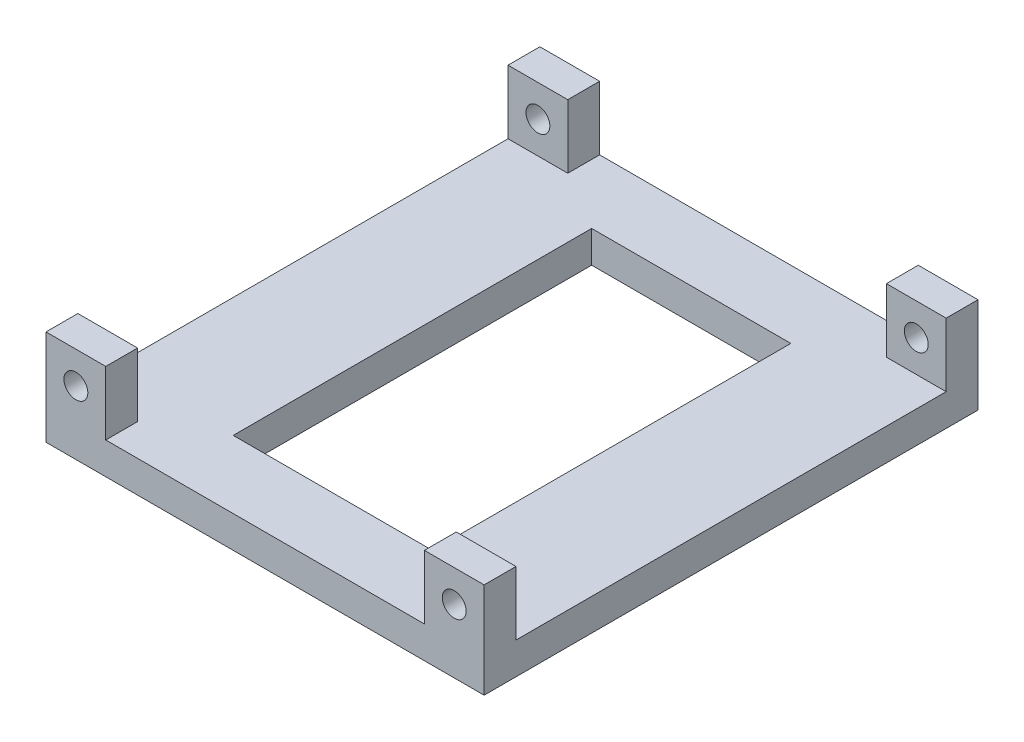
ISO-10303-21;
HEADER;
FILE_DESCRIPTION(('STEP AP214'),'2;1');
FILE_NAME('part.step','',(''),(''),'','','');
FILE_SCHEMA(('AUTOMOTIVE_DESIGN { 1 0 10303 214 1 1 1 1 }'));
ENDSEC;
DATA;
#1=APPLICATION_CONTEXT('core data for automotive mechanical design processes');
#2=APPLICATION_PROTOCOL_DEFINITION('international standard','automotive_design',2000,#1);
#3=PRODUCT_CONTEXT('',#1,'mechanical');
#4=PRODUCT('Part','Part','',(#3));
#5=PRODUCT_RELATED_PRODUCT_CATEGORY('part','',(#4));
#6=PRODUCT_DEFINITION_FORMATION('','',#4);
#7=PRODUCT_DEFINITION_CONTEXT('part definition',#1,'design');
#8=PRODUCT_DEFINITION('design','',#6,#7);
#9=PRODUCT_DEFINITION_SHAPE('','',#8);
#10=(LENGTH_UNIT() NAMED_UNIT(*) SI_UNIT(.MILLI.,.METRE.));
#11=(NAMED_UNIT(*) PLANE_ANGLE_UNIT() SI_UNIT($,.RADIAN.));
#12=(NAMED_UNIT(*) SI_UNIT($,.STERADIAN.) SOLID_ANGLE_UNIT());
#13=UNCERTAINTY_MEASURE_WITH_UNIT(LENGTH_MEASURE(1.E-05),#10,'distance_accuracy_value','');
#14=(GEOMETRIC_REPRESENTATION_CONTEXT(3) GLOBAL_UNCERTAINTY_ASSIGNED_CONTEXT((#13)) GLOBAL_UNIT_ASSIGNED_CONTEXT((#10,
#11,#12)) REPRESENTATION_CONTEXT('',''));
#15=CARTESIAN_POINT('',(0.,0.,0.));
#16=DIRECTION('',(0.,0.,1.));
#17=DIRECTION('',(1.,0.,0.));
#18=AXIS2_PLACEMENT_3D('',#15,#16,#17);
#19=CARTESIAN_POINT('',(0.,4.,0.));
#20=DIRECTION('',(0.,1.,0.));
#21=DIRECTION('',(0.,0.,1.));
#22=AXIS2_PLACEMENT_3D('',#19,#20,#21);
#23=PLANE('',#22);
#24=DIRECTION('',(1.,0.,0.));
#25=VECTOR('',#24,1.);
#26=CARTESIAN_POINT('',(27.5,4.,-27.));
#27=LINE('',#26,#25);
#28=CARTESIAN_POINT('',(20.,4.,-27.));
#29=VERTEX_POINT('',#28);
#30=CARTESIAN_POINT('',(27.5,4.,-27.));
#31=VERTEX_POINT('',#30);
#32=EDGE_CURVE('E61',#29,#31,#27,.T.);
#33=ORIENTED_EDGE('',*,*,#32,.F.);
#34=DIRECTION('',(0.,0.,-1.));
#35=VECTOR('',#34,1.);
#36=CARTESIAN_POINT('',(20.,4.,-27.));
#37=LINE('',#36,#35);
#38=CARTESIAN_POINT('',(20.,4.,-31.));
#39=VERTEX_POINT('',#38);
#40=EDGE_CURVE('E205',#29,#39,#37,.T.);
#41=ORIENTED_EDGE('',*,*,#40,.T.);
#42=DIRECTION('',(-1.,0.,0.));
#43=VECTOR('',#42,1.);
#44=CARTESIAN_POINT('',(-27.5,4.,-31.));
#45=LINE('',#44,#43);
#46=CARTESIAN_POINT('',(-20.,4.,-31.));
#47=VERTEX_POINT('',#46);
#48=EDGE_CURVE('E398',#39,#47,#45,.T.);
#49=ORIENTED_EDGE('',*,*,#48,.T.);
#50=DIRECTION('',(0.,0.,-1.));
#51=VECTOR('',#50,1.);
#52=CARTESIAN_POINT('',(-20.,4.,-27.));
#53=LINE('',#52,#51);
#54=CARTESIAN_POINT('',(-20.,4.,-27.));
#55=VERTEX_POINT('',#54);
#56=EDGE_CURVE('E256',#55,#47,#53,.T.);
#57=ORIENTED_EDGE('',*,*,#56,.F.);
#58=DIRECTION('',(1.,0.,0.));
#59=VECTOR('',#58,1.);
#60=CARTESIAN_POINT('',(-27.5,4.,-27.));
#61=LINE('',#60,#59);
#62=CARTESIAN_POINT('',(-27.5,4.,-27.));
#63=VERTEX_POINT('',#62);
#64=EDGE_CURVE('E246',#63,#55,#61,.T.);
#65=ORIENTED_EDGE('',*,*,#64,.F.);
#66=DIRECTION('',(0.,0.,1.));
#67=VECTOR('',#66,1.);
#68=CARTESIAN_POINT('',(-27.5,4.,-31.));
#69=LINE('',#68,#67);
#70=CARTESIAN_POINT('',(-27.5,4.,27.));
#71=VERTEX_POINT('',#70);
#72=EDGE_CURVE('E402',#63,#71,#69,.T.);
#73=ORIENTED_EDGE('',*,*,#72,.T.);
#74=DIRECTION('',(1.,0.,0.));
#75=VECTOR('',#74,1.);
#76=CARTESIAN_POINT('',(-27.5,4.,27.));
#77=LINE('',#76,#75);
#78=CARTESIAN_POINT('',(-20.,4.,27.));
#79=VERTEX_POINT('',#78);
#80=EDGE_CURVE('E322',#71,#79,#77,.T.);
#81=ORIENTED_EDGE('',*,*,#80,.T.);
#82=DIRECTION('',(0.,0.,1.));
#83=VECTOR('',#82,1.);
#84=CARTESIAN_POINT('',(-20.,4.,27.));
#85=LINE('',#84,#83);
#86=CARTESIAN_POINT('',(-20.,4.,31.));
#87=VERTEX_POINT('',#86);
#88=EDGE_CURVE('E335',#79,#87,#85,.T.);
#89=ORIENTED_EDGE('',*,*,#88,.T.);
#90=DIRECTION('',(1.,0.,0.));
#91=VECTOR('',#90,1.);
#92=CARTESIAN_POINT('',(-27.5,4.,31.));
#93=LINE('',#92,#91);
#94=CARTESIAN_POINT('',(20.,4.,31.));
#95=VERTEX_POINT('',#94);
#96=EDGE_CURVE('E405',#87,#95,#93,.T.);
#97=ORIENTED_EDGE('',*,*,#96,.T.);
#98=DIRECTION('',(0.,0.,1.));
#99=VECTOR('',#98,1.);
#100=CARTESIAN_POINT('',(20.,4.,27.));
#101=LINE('',#100,#99);
#102=CARTESIAN_POINT('',(20.,4.,27.));
#103=VERTEX_POINT('',#102);
#104=EDGE_CURVE('E260',#103,#95,#101,.T.);
#105=ORIENTED_EDGE('',*,*,#104,.F.);
#106=DIRECTION('',(1.,0.,0.));
#107=VECTOR('',#106,1.);
#108=CARTESIAN_POINT('',(27.5,4.,27.));
#109=LINE('',#108,#107);
#110=CARTESIAN_POINT('',(27.5,4.,27.));
#111=VERTEX_POINT('',#110);
#112=EDGE_CURVE('E284',#103,#111,#109,.T.);
#113=ORIENTED_EDGE('',*,*,#112,.T.);
#114=DIRECTION('',(0.,0.,-1.));
#115=VECTOR('',#114,1.);
#116=CARTESIAN_POINT('',(27.5,4.,-31.));
#117=LINE('',#116,#115);
#118=EDGE_CURVE('E66',#111,#31,#117,.T.);
#119=ORIENTED_EDGE('',*,*,#118,.T.);
#120=EDGE_LOOP('',(#33,#41,#49,#57,#65,#73,#81,#89,#97,#105,#113,#119));
#121=FACE_BOUND('',#120,.T.);
#122=DIRECTION('',(-1.,0.,0.));
#123=VECTOR('',#122,1.);
#124=CARTESIAN_POINT('',(-12.5,4.,-22.5));
#125=LINE('',#124,#123);
#126=CARTESIAN_POINT('',(12.5,4.,-22.5));
#127=VERTEX_POINT('',#126);
#128=CARTESIAN_POINT('',(-12.5,4.,-22.5));
#129=VERTEX_POINT('',#128);
#130=EDGE_CURVE('E356',#127,#129,#125,.T.);
#131=ORIENTED_EDGE('',*,*,#130,.F.);
#132=DIRECTION('',(0.,0.,-1.));
#133=VECTOR('',#132,1.);
#134=CARTESIAN_POINT('',(12.5,4.,-22.5));
#135=LINE('',#134,#133);
#136=CARTESIAN_POINT('',(12.5,4.,22.5));
#137=VERTEX_POINT('',#136);
#138=EDGE_CURVE('E353',#137,#127,#135,.T.);
#139=ORIENTED_EDGE('',*,*,#138,.F.);
#140=DIRECTION('',(1.,0.,0.));
#141=VECTOR('',#140,1.);
#142=CARTESIAN_POINT('',(-12.5,4.,22.5));
#143=LINE('',#142,#141);
#144=CARTESIAN_POINT('',(-12.5,4.,22.5));
#145=VERTEX_POINT('',#144);
#146=EDGE_CURVE('E364',#145,#137,#143,.T.);
#147=ORIENTED_EDGE('',*,*,#146,.F.);
#148=DIRECTION('',(0.,0.,1.));
#149=VECTOR('',#148,1.);
#150=CARTESIAN_POINT('',(-12.5,4.,-22.5));
#151=LINE('',#150,#149);
#152=EDGE_CURVE('E360',#129,#145,#151,.T.);
#153=ORIENTED_EDGE('',*,*,#152,.F.);
#154=EDGE_LOOP('',(#131,#139,#147,#153));
#155=FACE_BOUND('',#154,.T.);
#156=ADVANCED_FACE('F45',(#121,#155),#23,.T.);
#157=CARTESIAN_POINT('',(0.,0.,0.));
#158=DIRECTION('',(0.,1.,0.));
#159=DIRECTION('',(0.,0.,1.));
#160=AXIS2_PLACEMENT_3D('',#157,#158,#159);
#161=PLANE('',#160);
#162=DIRECTION('',(0.,0.,-1.));
#163=VECTOR('',#162,1.);
#164=CARTESIAN_POINT('',(27.5,0.,-31.));
#165=LINE('',#164,#163);
#166=CARTESIAN_POINT('',(27.5,0.,31.));
#167=VERTEX_POINT('',#166);
#168=CARTESIAN_POINT('',(27.5,0.,-31.));
#169=VERTEX_POINT('',#168);
#170=EDGE_CURVE('E395',#167,#169,#165,.T.);
#171=ORIENTED_EDGE('',*,*,#170,.F.);
#172=DIRECTION('',(1.,0.,0.));
#173=VECTOR('',#172,1.);
#174=CARTESIAN_POINT('',(-27.5,0.,31.));
#175=LINE('',#174,#173);
#176=CARTESIAN_POINT('',(-27.5,0.,31.));
#177=VERTEX_POINT('',#176);
#178=EDGE_CURVE('E399',#177,#167,#175,.T.);
#179=ORIENTED_EDGE('',*,*,#178,.F.);
#180=DIRECTION('',(0.,0.,1.));
#181=VECTOR('',#180,1.);
#182=CARTESIAN_POINT('',(-27.5,0.,-31.));
#183=LINE('',#182,#181);
#184=CARTESIAN_POINT('',(-27.5,0.,-31.));
#185=VERTEX_POINT('',#184);
#186=EDGE_CURVE('E415',#185,#177,#183,.T.);
#187=ORIENTED_EDGE('',*,*,#186,.F.);
#188=DIRECTION('',(-1.,0.,0.));
#189=VECTOR('',#188,1.);
#190=CARTESIAN_POINT('',(-27.5,0.,-31.));
#191=LINE('',#190,#189);
#192=EDGE_CURVE('E412',#169,#185,#191,.T.);
#193=ORIENTED_EDGE('',*,*,#192,.F.);
#194=EDGE_LOOP('',(#171,#179,#187,#193));
#195=FACE_BOUND('',#194,.T.);
#196=DIRECTION('',(0.,0.,-1.));
#197=VECTOR('',#196,1.);
#198=CARTESIAN_POINT('',(12.5,0.,-22.5));
#199=LINE('',#198,#197);
#200=CARTESIAN_POINT('',(12.5,0.,22.5));
#201=VERTEX_POINT('',#200);
#202=CARTESIAN_POINT('',(12.5,0.,-22.5));
#203=VERTEX_POINT('',#202);
#204=EDGE_CURVE('E346',#201,#203,#199,.T.);
#205=ORIENTED_EDGE('',*,*,#204,.T.);
#206=DIRECTION('',(-1.,0.,0.));
#207=VECTOR('',#206,1.);
#208=CARTESIAN_POINT('',(-12.5,0.,-22.5));
#209=LINE('',#208,#207);
#210=CARTESIAN_POINT('',(-12.5,0.,-22.5));
#211=VERTEX_POINT('',#210);
#212=EDGE_CURVE('E371',#203,#211,#209,.T.);
#213=ORIENTED_EDGE('',*,*,#212,.T.);
#214=DIRECTION('',(0.,0.,1.));
#215=VECTOR('',#214,1.);
#216=CARTESIAN_POINT('',(-12.5,0.,-22.5));
#217=LINE('',#216,#215);
#218=CARTESIAN_POINT('',(-12.5,0.,22.5));
#219=VERTEX_POINT('',#218);
#220=EDGE_CURVE('E375',#211,#219,#217,.T.);
#221=ORIENTED_EDGE('',*,*,#220,.T.);
#222=DIRECTION('',(1.,0.,0.));
#223=VECTOR('',#222,1.);
#224=CARTESIAN_POINT('',(-12.5,0.,22.5));
#225=LINE('',#224,#223);
#226=EDGE_CURVE('E357',#219,#201,#225,.T.);
#227=ORIENTED_EDGE('',*,*,#226,.T.);
#228=EDGE_LOOP('',(#205,#213,#221,#227));
#229=FACE_BOUND('',#228,.T.);
#230=ADVANCED_FACE('F438',(#195,#229),#161,.F.);
#231=CARTESIAN_POINT('',(27.5,4.,-31.));
#232=DIRECTION('',(-1.,0.,0.));
#233=DIRECTION('',(0.,0.,1.));
#234=AXIS2_PLACEMENT_3D('',#231,#232,#233);
#235=PLANE('',#234);
#236=ORIENTED_EDGE('',*,*,#170,.T.);
#237=DIRECTION('',(0.,-1.,0.));
#238=VECTOR('',#237,1.);
#239=CARTESIAN_POINT('',(27.5,4.,-31.));
#240=LINE('',#239,#238);
#241=CARTESIAN_POINT('',(27.5,12.,-31.));
#242=VERTEX_POINT('',#241);
#243=EDGE_CURVE('E11',#242,#169,#240,.T.);
#244=ORIENTED_EDGE('',*,*,#243,.F.);
#245=DIRECTION('',(0.,0.,-1.));
#246=VECTOR('',#245,1.);
#247=CARTESIAN_POINT('',(27.5,12.,-27.));
#248=LINE('',#247,#246);
#249=CARTESIAN_POINT('',(27.5,12.,-27.));
#250=VERTEX_POINT('',#249);
#251=EDGE_CURVE('E204',#250,#242,#248,.T.);
#252=ORIENTED_EDGE('',*,*,#251,.F.);
#253=DIRECTION('',(0.,1.,0.));
#254=VECTOR('',#253,1.);
#255=CARTESIAN_POINT('',(27.5,4.,-27.));
#256=LINE('',#255,#254);
#257=EDGE_CURVE('E189',#31,#250,#256,.T.);
#258=ORIENTED_EDGE('',*,*,#257,.F.);
#259=ORIENTED_EDGE('',*,*,#118,.F.);
#260=DIRECTION('',(0.,1.,0.));
#261=VECTOR('',#260,1.);
#262=CARTESIAN_POINT('',(27.5,4.,27.));
#263=LINE('',#262,#261);
#264=CARTESIAN_POINT('',(27.5,12.,27.));
#265=VERTEX_POINT('',#264);
#266=EDGE_CURVE('E296',#111,#265,#263,.T.);
#267=ORIENTED_EDGE('',*,*,#266,.T.);
#268=DIRECTION('',(0.,0.,1.));
#269=VECTOR('',#268,1.);
#270=CARTESIAN_POINT('',(27.5,12.,27.));
#271=LINE('',#270,#269);
#272=CARTESIAN_POINT('',(27.5,12.,31.));
#273=VERTEX_POINT('',#272);
#274=EDGE_CURVE('E268',#265,#273,#271,.T.);
#275=ORIENTED_EDGE('',*,*,#274,.T.);
#276=DIRECTION('',(0.,-1.,0.));
#277=VECTOR('',#276,1.);
#278=CARTESIAN_POINT('',(27.5,4.,31.));
#279=LINE('',#278,#277);
#280=EDGE_CURVE('E408',#273,#167,#279,.T.);
#281=ORIENTED_EDGE('',*,*,#280,.T.);
#282=EDGE_LOOP('',(#236,#244,#252,#258,#259,#267,#275,#281));
#283=FACE_BOUND('',#282,.T.);
#284=ADVANCED_FACE('F47',(#283),#235,.F.);
#285=CARTESIAN_POINT('',(-27.5,4.,-31.));
#286=DIRECTION('',(0.,0.,1.));
#287=DIRECTION('',(1.,0.,0.));
#288=AXIS2_PLACEMENT_3D('',#285,#286,#287);
#289=PLANE('',#288);
#290=ORIENTED_EDGE('',*,*,#192,.T.);
#291=DIRECTION('',(0.,-1.,0.));
#292=VECTOR('',#291,1.);
#293=CARTESIAN_POINT('',(-27.5,4.,-31.));
#294=LINE('',#293,#292);
#295=CARTESIAN_POINT('',(-27.5,12.,-31.));
#296=VERTEX_POINT('',#295);
#297=EDGE_CURVE('E54',#296,#185,#294,.T.);
#298=ORIENTED_EDGE('',*,*,#297,.F.);
#299=DIRECTION('',(-1.,0.,0.));
#300=VECTOR('',#299,1.);
#301=CARTESIAN_POINT('',(-27.5,12.,-31.));
#302=LINE('',#301,#300);
#303=CARTESIAN_POINT('',(-20.,12.,-31.));
#304=VERTEX_POINT('',#303);
#305=EDGE_CURVE('E231',#304,#296,#302,.T.);
#306=ORIENTED_EDGE('',*,*,#305,.F.);
#307=DIRECTION('',(0.,1.,0.));
#308=VECTOR('',#307,1.);
#309=CARTESIAN_POINT('',(-20.,4.,-31.));
#310=LINE('',#309,#308);
#311=EDGE_CURVE('E240',#47,#304,#310,.T.);
#312=ORIENTED_EDGE('',*,*,#311,.F.);
#313=ORIENTED_EDGE('',*,*,#48,.F.);
#314=DIRECTION('',(0.,-1.,0.));
#315=VECTOR('',#314,1.);
#316=CARTESIAN_POINT('',(20.,4.,-31.));
#317=LINE('',#316,#315);
#318=CARTESIAN_POINT('',(20.,12.,-31.));
#319=VERTEX_POINT('',#318);
#320=EDGE_CURVE('E216',#319,#39,#317,.T.);
#321=ORIENTED_EDGE('',*,*,#320,.F.);
#322=DIRECTION('',(-1.,0.,0.));
#323=VECTOR('',#322,1.);
#324=CARTESIAN_POINT('',(27.5,12.,-31.));
#325=LINE('',#324,#323);
#326=EDGE_CURVE('E199',#242,#319,#325,.T.);
#327=ORIENTED_EDGE('',*,*,#326,.F.);
#328=ORIENTED_EDGE('',*,*,#243,.T.);
#329=EDGE_LOOP('',(#290,#298,#306,#312,#313,#321,#327,#328));
#330=FACE_BOUND('',#329,.T.);
#331=CARTESIAN_POINT('',(-23.75,8.,-31.));
#332=DIRECTION('',(0.,0.,1.));
#333=DIRECTION('',(1.,0.,0.));
#334=AXIS2_PLACEMENT_3D('',#331,#332,#333);
#335=CIRCLE('',#334,1.5);
#336=CARTESIAN_POINT('',(-22.25,8.,-31.));
#337=VERTEX_POINT('',#336);
#338=EDGE_CURVE('E223',#337,#337,#335,.T.);
#339=ORIENTED_EDGE('',*,*,#338,.T.);
#340=EDGE_LOOP('',(#339));
#341=FACE_BOUND('',#340,.T.);
#342=CARTESIAN_POINT('',(23.75,8.,-31.));
#343=DIRECTION('',(0.,0.,1.));
#344=DIRECTION('',(-1.,0.,0.));
#345=AXIS2_PLACEMENT_3D('',#342,#343,#344);
#346=CIRCLE('',#345,1.5);
#347=CARTESIAN_POINT('',(22.25,8.,-31.));
#348=VERTEX_POINT('',#347);
#349=EDGE_CURVE('E494',#348,#348,#346,.T.);
#350=ORIENTED_EDGE('',*,*,#349,.T.);
#351=EDGE_LOOP('',(#350));
#352=FACE_BOUND('',#351,.T.);
#353=ADVANCED_FACE('F485',(#330,#341,#352),#289,.F.);
#354=CARTESIAN_POINT('',(-27.5,4.,-31.));
#355=DIRECTION('',(1.,0.,0.));
#356=DIRECTION('',(0.,0.,-1.));
#357=AXIS2_PLACEMENT_3D('',#354,#355,#356);
#358=PLANE('',#357);
#359=ORIENTED_EDGE('',*,*,#186,.T.);
#360=DIRECTION('',(0.,-1.,0.));
#361=VECTOR('',#360,1.);
#362=CARTESIAN_POINT('',(-27.5,4.,31.));
#363=LINE('',#362,#361);
#364=CARTESIAN_POINT('',(-27.5,12.,31.));
#365=VERTEX_POINT('',#364);
#366=EDGE_CURVE('E423',#365,#177,#363,.T.);
#367=ORIENTED_EDGE('',*,*,#366,.F.);
#368=DIRECTION('',(0.,0.,1.));
#369=VECTOR('',#368,1.);
#370=CARTESIAN_POINT('',(-27.5,12.,27.));
#371=LINE('',#370,#369);
#372=CARTESIAN_POINT('',(-27.5,12.,27.));
#373=VERTEX_POINT('',#372);
#374=EDGE_CURVE('E342',#373,#365,#371,.T.);
#375=ORIENTED_EDGE('',*,*,#374,.F.);
#376=DIRECTION('',(0.,-1.,0.));
#377=VECTOR('',#376,1.);
#378=CARTESIAN_POINT('',(-27.5,4.,27.));
#379=LINE('',#378,#377);
#380=EDGE_CURVE('E318',#373,#71,#379,.T.);
#381=ORIENTED_EDGE('',*,*,#380,.T.);
#382=ORIENTED_EDGE('',*,*,#72,.F.);
#383=DIRECTION('',(0.,-1.,0.));
#384=VECTOR('',#383,1.);
#385=CARTESIAN_POINT('',(-27.5,4.,-27.));
#386=LINE('',#385,#384);
#387=CARTESIAN_POINT('',(-27.5,12.,-27.));
#388=VERTEX_POINT('',#387);
#389=EDGE_CURVE('E235',#388,#63,#386,.T.);
#390=ORIENTED_EDGE('',*,*,#389,.F.);
#391=DIRECTION('',(0.,0.,-1.));
#392=VECTOR('',#391,1.);
#393=CARTESIAN_POINT('',(-27.5,12.,-27.));
#394=LINE('',#393,#392);
#395=EDGE_CURVE('E250',#388,#296,#394,.T.);
#396=ORIENTED_EDGE('',*,*,#395,.T.);
#397=ORIENTED_EDGE('',*,*,#297,.T.);
#398=EDGE_LOOP('',(#359,#367,#375,#381,#382,#390,#396,#397));
#399=FACE_BOUND('',#398,.T.);
#400=ADVANCED_FACE('F430',(#399),#358,.F.);
#401=CARTESIAN_POINT('',(-27.5,4.,31.));
#402=DIRECTION('',(0.,0.,-1.));
#403=DIRECTION('',(-1.,0.,0.));
#404=AXIS2_PLACEMENT_3D('',#401,#402,#403);
#405=PLANE('',#404);
#406=ORIENTED_EDGE('',*,*,#178,.T.);
#407=ORIENTED_EDGE('',*,*,#280,.F.);
#408=DIRECTION('',(-1.,0.,0.));
#409=VECTOR('',#408,1.);
#410=CARTESIAN_POINT('',(27.5,12.,31.));
#411=LINE('',#410,#409);
#412=CARTESIAN_POINT('',(20.,12.,31.));
#413=VERTEX_POINT('',#412);
#414=EDGE_CURVE('E283',#273,#413,#411,.T.);
#415=ORIENTED_EDGE('',*,*,#414,.T.);
#416=DIRECTION('',(0.,-1.,0.));
#417=VECTOR('',#416,1.);
#418=CARTESIAN_POINT('',(20.,4.,31.));
#419=LINE('',#418,#417);
#420=EDGE_CURVE('E279',#413,#95,#419,.T.);
#421=ORIENTED_EDGE('',*,*,#420,.T.);
#422=ORIENTED_EDGE('',*,*,#96,.F.);
#423=DIRECTION('',(0.,1.,0.));
#424=VECTOR('',#423,1.);
#425=CARTESIAN_POINT('',(-20.,4.,31.));
#426=LINE('',#425,#424);
#427=CARTESIAN_POINT('',(-20.,12.,31.));
#428=VERTEX_POINT('',#427);
#429=EDGE_CURVE('E314',#87,#428,#426,.T.);
#430=ORIENTED_EDGE('',*,*,#429,.T.);
#431=DIRECTION('',(-1.,0.,0.));
#432=VECTOR('',#431,1.);
#433=CARTESIAN_POINT('',(-27.5,12.,31.));
#434=LINE('',#433,#432);
#435=EDGE_CURVE('E323',#428,#365,#434,.T.);
#436=ORIENTED_EDGE('',*,*,#435,.T.);
#437=ORIENTED_EDGE('',*,*,#366,.T.);
#438=EDGE_LOOP('',(#406,#407,#415,#421,#422,#430,#436,#437));
#439=FACE_BOUND('',#438,.T.);
#440=CARTESIAN_POINT('',(-23.75,8.,31.));
#441=DIRECTION('',(0.,0.,1.));
#442=DIRECTION('',(1.,0.,0.));
#443=AXIS2_PLACEMENT_3D('',#440,#441,#442);
#444=CIRCLE('',#443,1.5);
#445=CARTESIAN_POINT('',(-22.25,8.,31.));
#446=VERTEX_POINT('',#445);
#447=EDGE_CURVE('E306',#446,#446,#444,.T.);
#448=ORIENTED_EDGE('',*,*,#447,.F.);
#449=EDGE_LOOP('',(#448));
#450=FACE_BOUND('',#449,.T.);
#451=CARTESIAN_POINT('',(23.75,8.,31.));
#452=DIRECTION('',(0.,0.,1.));
#453=DIRECTION('',(-1.,0.,0.));
#454=AXIS2_PLACEMENT_3D('',#451,#452,#453);
#455=CIRCLE('',#454,1.5);
#456=CARTESIAN_POINT('',(22.25,8.,31.));
#457=VERTEX_POINT('',#456);
#458=EDGE_CURVE('E302',#457,#457,#455,.T.);
#459=ORIENTED_EDGE('',*,*,#458,.F.);
#460=EDGE_LOOP('',(#459));
#461=FACE_BOUND('',#460,.T.);
#462=ADVANCED_FACE('F441',(#439,#450,#461),#405,.F.);
#463=CARTESIAN_POINT('',(12.5,4.,-22.5));
#464=DIRECTION('',(-1.,0.,0.));
#465=DIRECTION('',(0.,0.,1.));
#466=AXIS2_PLACEMENT_3D('',#463,#464,#465);
#467=PLANE('',#466);
#468=ORIENTED_EDGE('',*,*,#204,.F.);
#469=DIRECTION('',(0.,-1.,0.));
#470=VECTOR('',#469,1.);
#471=CARTESIAN_POINT('',(12.5,4.,22.5));
#472=LINE('',#471,#470);
#473=EDGE_CURVE('E367',#137,#201,#472,.T.);
#474=ORIENTED_EDGE('',*,*,#473,.F.);
#475=ORIENTED_EDGE('',*,*,#138,.T.);
#476=DIRECTION('',(0.,-1.,0.));
#477=VECTOR('',#476,1.);
#478=CARTESIAN_POINT('',(12.5,4.,-22.5));
#479=LINE('',#478,#477);
#480=EDGE_CURVE('E391',#127,#203,#479,.T.);
#481=ORIENTED_EDGE('',*,*,#480,.T.);
#482=EDGE_LOOP('',(#468,#474,#475,#481));
#483=FACE_BOUND('',#482,.T.);
#484=ADVANCED_FACE('F479',(#483),#467,.T.);
#485=CARTESIAN_POINT('',(-12.5,4.,-22.5));
#486=DIRECTION('',(0.,0.,1.));
#487=DIRECTION('',(1.,0.,0.));
#488=AXIS2_PLACEMENT_3D('',#485,#486,#487);
#489=PLANE('',#488);
#490=ORIENTED_EDGE('',*,*,#212,.F.);
#491=ORIENTED_EDGE('',*,*,#480,.F.);
#492=ORIENTED_EDGE('',*,*,#130,.T.);
#493=DIRECTION('',(0.,-1.,0.));
#494=VECTOR('',#493,1.);
#495=CARTESIAN_POINT('',(-12.5,4.,-22.5));
#496=LINE('',#495,#494);
#497=EDGE_CURVE('E388',#129,#211,#496,.T.);
#498=ORIENTED_EDGE('',*,*,#497,.T.);
#499=EDGE_LOOP('',(#490,#491,#492,#498));
#500=FACE_BOUND('',#499,.T.);
#501=ADVANCED_FACE('F557',(#500),#489,.T.);
#502=CARTESIAN_POINT('',(-12.5,4.,-22.5));
#503=DIRECTION('',(1.,0.,0.));
#504=DIRECTION('',(0.,0.,-1.));
#505=AXIS2_PLACEMENT_3D('',#502,#503,#504);
#506=PLANE('',#505);
#507=ORIENTED_EDGE('',*,*,#220,.F.);
#508=ORIENTED_EDGE('',*,*,#497,.F.);
#509=ORIENTED_EDGE('',*,*,#152,.T.);
#510=DIRECTION('',(0.,-1.,0.));
#511=VECTOR('',#510,1.);
#512=CARTESIAN_POINT('',(-12.5,4.,22.5));
#513=LINE('',#512,#511);
#514=EDGE_CURVE('E385',#145,#219,#513,.T.);
#515=ORIENTED_EDGE('',*,*,#514,.T.);
#516=EDGE_LOOP('',(#507,#508,#509,#515));
#517=FACE_BOUND('',#516,.T.);
#518=ADVANCED_FACE('F554',(#517),#506,.T.);
#519=CARTESIAN_POINT('',(-12.5,4.,22.5));
#520=DIRECTION('',(0.,0.,-1.));
#521=DIRECTION('',(-1.,0.,0.));
#522=AXIS2_PLACEMENT_3D('',#519,#520,#521);
#523=PLANE('',#522);
#524=ORIENTED_EDGE('',*,*,#226,.F.);
#525=ORIENTED_EDGE('',*,*,#514,.F.);
#526=ORIENTED_EDGE('',*,*,#146,.T.);
#527=ORIENTED_EDGE('',*,*,#473,.T.);
#528=EDGE_LOOP('',(#524,#525,#526,#527));
#529=FACE_BOUND('',#528,.T.);
#530=ADVANCED_FACE('F547',(#529),#523,.T.);
#531=CARTESIAN_POINT('',(-27.5,12.,27.));
#532=DIRECTION('',(0.,1.,0.));
#533=DIRECTION('',(0.,0.,1.));
#534=AXIS2_PLACEMENT_3D('',#531,#532,#533);
#535=PLANE('',#534);
#536=ORIENTED_EDGE('',*,*,#435,.F.);
#537=DIRECTION('',(0.,0.,1.));
#538=VECTOR('',#537,1.);
#539=CARTESIAN_POINT('',(-20.,12.,27.));
#540=LINE('',#539,#538);
#541=CARTESIAN_POINT('',(-20.,12.,27.));
#542=VERTEX_POINT('',#541);
#543=EDGE_CURVE('E347',#542,#428,#540,.T.);
#544=ORIENTED_EDGE('',*,*,#543,.F.);
#545=DIRECTION('',(-1.,0.,0.));
#546=VECTOR('',#545,1.);
#547=CARTESIAN_POINT('',(-27.5,12.,27.));
#548=LINE('',#547,#546);
#549=EDGE_CURVE('E331',#542,#373,#548,.T.);
#550=ORIENTED_EDGE('',*,*,#549,.T.);
#551=ORIENTED_EDGE('',*,*,#374,.T.);
#552=EDGE_LOOP('',(#536,#544,#550,#551));
#553=FACE_BOUND('',#552,.T.);
#554=ADVANCED_FACE('F544',(#553),#535,.T.);
#555=CARTESIAN_POINT('',(-20.,4.,27.));
#556=DIRECTION('',(1.,0.,0.));
#557=DIRECTION('',(0.,0.,-1.));
#558=AXIS2_PLACEMENT_3D('',#555,#556,#557);
#559=PLANE('',#558);
#560=ORIENTED_EDGE('',*,*,#429,.F.);
#561=ORIENTED_EDGE('',*,*,#88,.F.);
#562=DIRECTION('',(0.,1.,0.));
#563=VECTOR('',#562,1.);
#564=CARTESIAN_POINT('',(-20.,4.,27.));
#565=LINE('',#564,#563);
#566=EDGE_CURVE('E327',#79,#542,#565,.T.);
#567=ORIENTED_EDGE('',*,*,#566,.T.);
#568=ORIENTED_EDGE('',*,*,#543,.T.);
#569=EDGE_LOOP('',(#560,#561,#567,#568));
#570=FACE_BOUND('',#569,.T.);
#571=ADVANCED_FACE('F538',(#570),#559,.T.);
#572=CARTESIAN_POINT('',(0.,0.,27.));
#573=DIRECTION('',(0.,0.,-1.));
#574=DIRECTION('',(-1.,0.,0.));
#575=AXIS2_PLACEMENT_3D('',#572,#573,#574);
#576=PLANE('',#575);
#577=CARTESIAN_POINT('',(-23.75,8.,27.));
#578=DIRECTION('',(0.,0.,1.));
#579=DIRECTION('',(1.,0.,0.));
#580=AXIS2_PLACEMENT_3D('',#577,#578,#579);
#581=CIRCLE('',#580,1.5);
#582=CARTESIAN_POINT('',(-22.25,8.,27.));
#583=VERTEX_POINT('',#582);
#584=EDGE_CURVE('E310',#583,#583,#581,.T.);
#585=ORIENTED_EDGE('',*,*,#584,.T.);
#586=EDGE_LOOP('',(#585));
#587=FACE_BOUND('',#586,.T.);
#588=ORIENTED_EDGE('',*,*,#380,.F.);
#589=ORIENTED_EDGE('',*,*,#549,.F.);
#590=ORIENTED_EDGE('',*,*,#566,.F.);
#591=ORIENTED_EDGE('',*,*,#80,.F.);
#592=EDGE_LOOP('',(#588,#589,#590,#591));
#593=FACE_BOUND('',#592,.T.);
#594=ADVANCED_FACE('F532',(#587,#593),#576,.T.);
#595=CARTESIAN_POINT('',(-23.75,8.,27.));
#596=DIRECTION('',(0.,0.,1.));
#597=DIRECTION('',(1.,0.,0.));
#598=AXIS2_PLACEMENT_3D('',#595,#596,#597);
#599=CYLINDRICAL_SURFACE('',#598,1.5);
#600=ORIENTED_EDGE('',*,*,#584,.F.);
#601=EDGE_LOOP('',(#600));
#602=FACE_BOUND('',#601,.T.);
#603=ORIENTED_EDGE('',*,*,#447,.T.);
#604=EDGE_LOOP('',(#603));
#605=FACE_BOUND('',#604,.T.);
#606=ADVANCED_FACE('F528',(#602,#605),#599,.F.);
#607=CARTESIAN_POINT('',(20.,4.,27.));
#608=DIRECTION('',(-1.,0.,0.));
#609=DIRECTION('',(0.,0.,1.));
#610=AXIS2_PLACEMENT_3D('',#607,#608,#609);
#611=PLANE('',#610);
#612=ORIENTED_EDGE('',*,*,#420,.F.);
#613=DIRECTION('',(0.,0.,1.));
#614=VECTOR('',#613,1.);
#615=CARTESIAN_POINT('',(20.,12.,27.));
#616=LINE('',#615,#614);
#617=CARTESIAN_POINT('',(20.,12.,27.));
#618=VERTEX_POINT('',#617);
#619=EDGE_CURVE('E273',#618,#413,#616,.T.);
#620=ORIENTED_EDGE('',*,*,#619,.F.);
#621=DIRECTION('',(0.,-1.,0.));
#622=VECTOR('',#621,1.);
#623=CARTESIAN_POINT('',(20.,4.,27.));
#624=LINE('',#623,#622);
#625=EDGE_CURVE('E272',#618,#103,#624,.T.);
#626=ORIENTED_EDGE('',*,*,#625,.T.);
#627=ORIENTED_EDGE('',*,*,#104,.T.);
#628=EDGE_LOOP('',(#612,#620,#626,#627));
#629=FACE_BOUND('',#628,.T.);
#630=ADVANCED_FACE('F452',(#629),#611,.T.);
#631=CARTESIAN_POINT('',(27.5,12.,27.));
#632=DIRECTION('',(0.,1.,0.));
#633=DIRECTION('',(0.,0.,1.));
#634=AXIS2_PLACEMENT_3D('',#631,#632,#633);
#635=PLANE('',#634);
#636=ORIENTED_EDGE('',*,*,#414,.F.);
#637=ORIENTED_EDGE('',*,*,#274,.F.);
#638=DIRECTION('',(-1.,0.,0.));
#639=VECTOR('',#638,1.);
#640=CARTESIAN_POINT('',(27.5,12.,27.));
#641=LINE('',#640,#639);
#642=EDGE_CURVE('E292',#265,#618,#641,.T.);
#643=ORIENTED_EDGE('',*,*,#642,.T.);
#644=ORIENTED_EDGE('',*,*,#619,.T.);
#645=EDGE_LOOP('',(#636,#637,#643,#644));
#646=FACE_BOUND('',#645,.T.);
#647=ADVANCED_FACE('F448',(#646),#635,.T.);
#648=CARTESIAN_POINT('',(0.,0.,27.));
#649=DIRECTION('',(0.,0.,-1.));
#650=DIRECTION('',(-1.,0.,0.));
#651=AXIS2_PLACEMENT_3D('',#648,#649,#650);
#652=PLANE('',#651);
#653=CARTESIAN_POINT('',(23.75,8.,27.));
#654=DIRECTION('',(0.,0.,1.));
#655=DIRECTION('',(-1.,0.,0.));
#656=AXIS2_PLACEMENT_3D('',#653,#654,#655);
#657=CIRCLE('',#656,1.5);
#658=CARTESIAN_POINT('',(22.25,8.,27.));
#659=VERTEX_POINT('',#658);
#660=EDGE_CURVE('E288',#659,#659,#657,.T.);
#661=ORIENTED_EDGE('',*,*,#660,.T.);
#662=EDGE_LOOP('',(#661));
#663=FACE_BOUND('',#662,.T.);
#664=ORIENTED_EDGE('',*,*,#112,.F.);
#665=ORIENTED_EDGE('',*,*,#625,.F.);
#666=ORIENTED_EDGE('',*,*,#642,.F.);
#667=ORIENTED_EDGE('',*,*,#266,.F.);
#668=EDGE_LOOP('',(#664,#665,#666,#667));
#669=FACE_BOUND('',#668,.T.);
#670=ADVANCED_FACE('F457',(#663,#669),#652,.T.);
#671=CARTESIAN_POINT('',(23.75,8.,27.));
#672=DIRECTION('',(0.,0.,1.));
#673=DIRECTION('',(1.,0.,0.));
#674=AXIS2_PLACEMENT_3D('',#671,#672,#673);
#675=CYLINDRICAL_SURFACE('',#674,1.5);
#676=ORIENTED_EDGE('',*,*,#660,.F.);
#677=EDGE_LOOP('',(#676));
#678=FACE_BOUND('',#677,.T.);
#679=ORIENTED_EDGE('',*,*,#458,.T.);
#680=EDGE_LOOP('',(#679));
#681=FACE_BOUND('',#680,.T.);
#682=ADVANCED_FACE('F459',(#678,#681),#675,.F.);
#683=CARTESIAN_POINT('',(0.,0.,-27.));
#684=DIRECTION('',(0.,0.,1.));
#685=DIRECTION('',(-1.,0.,0.));
#686=AXIS2_PLACEMENT_3D('',#683,#684,#685);
#687=PLANE('',#686);
#688=ORIENTED_EDGE('',*,*,#389,.T.);
#689=ORIENTED_EDGE('',*,*,#64,.T.);
#690=DIRECTION('',(0.,1.,0.));
#691=VECTOR('',#690,1.);
#692=CARTESIAN_POINT('',(-20.,4.,-27.));
#693=LINE('',#692,#691);
#694=CARTESIAN_POINT('',(-20.,12.,-27.));
#695=VERTEX_POINT('',#694);
#696=EDGE_CURVE('E243',#55,#695,#693,.T.);
#697=ORIENTED_EDGE('',*,*,#696,.T.);
#698=DIRECTION('',(-1.,0.,0.));
#699=VECTOR('',#698,1.);
#700=CARTESIAN_POINT('',(-27.5,12.,-27.));
#701=LINE('',#700,#699);
#702=EDGE_CURVE('E239',#695,#388,#701,.T.);
#703=ORIENTED_EDGE('',*,*,#702,.T.);
#704=EDGE_LOOP('',(#688,#689,#697,#703));
#705=FACE_BOUND('',#704,.T.);
#706=CARTESIAN_POINT('',(-23.75,8.,-27.));
#707=DIRECTION('',(0.,0.,1.));
#708=DIRECTION('',(1.,0.,0.));
#709=AXIS2_PLACEMENT_3D('',#706,#707,#708);
#710=CIRCLE('',#709,1.5);
#711=CARTESIAN_POINT('',(-22.25,8.,-27.));
#712=VERTEX_POINT('',#711);
#713=EDGE_CURVE('E227',#712,#712,#710,.T.);
#714=ORIENTED_EDGE('',*,*,#713,.F.);
#715=EDGE_LOOP('',(#714));
#716=FACE_BOUND('',#715,.T.);
#717=ADVANCED_FACE('F466',(#705,#716),#687,.T.);
#718=CARTESIAN_POINT('',(-20.,4.,-27.));
#719=DIRECTION('',(-1.,0.,0.));
#720=DIRECTION('',(0.,0.,1.));
#721=AXIS2_PLACEMENT_3D('',#718,#719,#720);
#722=PLANE('',#721);
#723=ORIENTED_EDGE('',*,*,#311,.T.);
#724=DIRECTION('',(0.,0.,-1.));
#725=VECTOR('',#724,1.);
#726=CARTESIAN_POINT('',(-20.,12.,-27.));
#727=LINE('',#726,#725);
#728=EDGE_CURVE('E261',#695,#304,#727,.T.);
#729=ORIENTED_EDGE('',*,*,#728,.F.);
#730=ORIENTED_EDGE('',*,*,#696,.F.);
#731=ORIENTED_EDGE('',*,*,#56,.T.);
#732=EDGE_LOOP('',(#723,#729,#730,#731));
#733=FACE_BOUND('',#732,.T.);
#734=ADVANCED_FACE('F520',(#733),#722,.F.);
#735=CARTESIAN_POINT('',(-27.5,12.,-27.));
#736=DIRECTION('',(0.,-1.,0.));
#737=DIRECTION('',(0.,0.,-1.));
#738=AXIS2_PLACEMENT_3D('',#735,#736,#737);
#739=PLANE('',#738);
#740=ORIENTED_EDGE('',*,*,#305,.T.);
#741=ORIENTED_EDGE('',*,*,#395,.F.);
#742=ORIENTED_EDGE('',*,*,#702,.F.);
#743=ORIENTED_EDGE('',*,*,#728,.T.);
#744=EDGE_LOOP('',(#740,#741,#742,#743));
#745=FACE_BOUND('',#744,.T.);
#746=ADVANCED_FACE('F511',(#745),#739,.F.);
#747=CARTESIAN_POINT('',(-23.75,8.,-27.));
#748=DIRECTION('',(0.,0.,-1.));
#749=DIRECTION('',(-1.,0.,0.));
#750=AXIS2_PLACEMENT_3D('',#747,#748,#749);
#751=CYLINDRICAL_SURFACE('',#750,1.5);
#752=ORIENTED_EDGE('',*,*,#713,.T.);
#753=EDGE_LOOP('',(#752));
#754=FACE_BOUND('',#753,.T.);
#755=ORIENTED_EDGE('',*,*,#338,.F.);
#756=EDGE_LOOP('',(#755));
#757=FACE_BOUND('',#756,.T.);
#758=ADVANCED_FACE('F504',(#754,#757),#751,.F.);
#759=CARTESIAN_POINT('',(0.,0.,-27.));
#760=DIRECTION('',(0.,0.,1.));
#761=DIRECTION('',(-1.,0.,0.));
#762=AXIS2_PLACEMENT_3D('',#759,#760,#761);
#763=PLANE('',#762);
#764=ORIENTED_EDGE('',*,*,#32,.T.);
#765=ORIENTED_EDGE('',*,*,#257,.T.);
#766=DIRECTION('',(-1.,0.,0.));
#767=VECTOR('',#766,1.);
#768=CARTESIAN_POINT('',(27.5,12.,-27.));
#769=LINE('',#768,#767);
#770=CARTESIAN_POINT('',(20.,12.,-27.));
#771=VERTEX_POINT('',#770);
#772=EDGE_CURVE('E182',#250,#771,#769,.T.);
#773=ORIENTED_EDGE('',*,*,#772,.T.);
#774=DIRECTION('',(0.,-1.,0.));
#775=VECTOR('',#774,1.);
#776=CARTESIAN_POINT('',(20.,4.,-27.));
#777=LINE('',#776,#775);
#778=EDGE_CURVE('E187',#771,#29,#777,.T.);
#779=ORIENTED_EDGE('',*,*,#778,.T.);
#780=EDGE_LOOP('',(#764,#765,#773,#779));
#781=FACE_BOUND('',#780,.T.);
#782=CARTESIAN_POINT('',(23.75,8.,-27.));
#783=DIRECTION('',(0.,0.,1.));
#784=DIRECTION('',(-1.,0.,0.));
#785=AXIS2_PLACEMENT_3D('',#782,#783,#784);
#786=CIRCLE('',#785,1.5);
#787=CARTESIAN_POINT('',(22.25,8.,-27.));
#788=VERTEX_POINT('',#787);
#789=EDGE_CURVE('E219',#788,#788,#786,.T.);
#790=ORIENTED_EDGE('',*,*,#789,.F.);
#791=EDGE_LOOP('',(#790));
#792=FACE_BOUND('',#791,.T.);
#793=ADVANCED_FACE('F184',(#781,#792),#763,.T.);
#794=CARTESIAN_POINT('',(27.5,12.,-27.));
#795=DIRECTION('',(0.,-1.,0.));
#796=DIRECTION('',(0.,0.,-1.));
#797=AXIS2_PLACEMENT_3D('',#794,#795,#796);
#798=PLANE('',#797);
#799=ORIENTED_EDGE('',*,*,#326,.T.);
#800=DIRECTION('',(0.,0.,-1.));
#801=VECTOR('',#800,1.);
#802=CARTESIAN_POINT('',(20.,12.,-27.));
#803=LINE('',#802,#801);
#804=EDGE_CURVE('E196',#771,#319,#803,.T.);
#805=ORIENTED_EDGE('',*,*,#804,.F.);
#806=ORIENTED_EDGE('',*,*,#772,.F.);
#807=ORIENTED_EDGE('',*,*,#251,.T.);
#808=EDGE_LOOP('',(#799,#805,#806,#807));
#809=FACE_BOUND('',#808,.T.);
#810=ADVANCED_FACE('F197',(#809),#798,.F.);
#811=CARTESIAN_POINT('',(20.,4.,-27.));
#812=DIRECTION('',(1.,0.,0.));
#813=DIRECTION('',(0.,0.,-1.));
#814=AXIS2_PLACEMENT_3D('',#811,#812,#813);
#815=PLANE('',#814);
#816=ORIENTED_EDGE('',*,*,#320,.T.);
#817=ORIENTED_EDGE('',*,*,#40,.F.);
#818=ORIENTED_EDGE('',*,*,#778,.F.);
#819=ORIENTED_EDGE('',*,*,#804,.T.);
#820=EDGE_LOOP('',(#816,#817,#818,#819));
#821=FACE_BOUND('',#820,.T.);
#822=ADVANCED_FACE('F207',(#821),#815,.F.);
#823=CARTESIAN_POINT('',(23.75,8.,-27.));
#824=DIRECTION('',(0.,0.,-1.));
#825=DIRECTION('',(-1.,0.,0.));
#826=AXIS2_PLACEMENT_3D('',#823,#824,#825);
#827=CYLINDRICAL_SURFACE('',#826,1.5);
#828=ORIENTED_EDGE('',*,*,#789,.T.);
#829=EDGE_LOOP('',(#828));
#830=FACE_BOUND('',#829,.T.);
#831=ORIENTED_EDGE('',*,*,#349,.F.);
#832=EDGE_LOOP('',(#831));
#833=FACE_BOUND('',#832,.T.);
#834=ADVANCED_FACE('F502',(#830,#833),#827,.F.);
#835=CLOSED_SHELL('',(#156,#230,#284,#353,#400,#462,#484,#501,#518,#530,#554,#571,#594,#606,
#630,#647,#670,#682,#717,#734,#746,#758,#793,#810,#822,#834));
#836=MANIFOLD_SOLID_BREP('B2',#835);
#837=ADVANCED_BREP_SHAPE_REPRESENTATION('',(#18,#836),#14);
#838=SHAPE_DEFINITION_REPRESENTATION(#9,#837);
ENDSEC;
END-ISO-10303-21;
